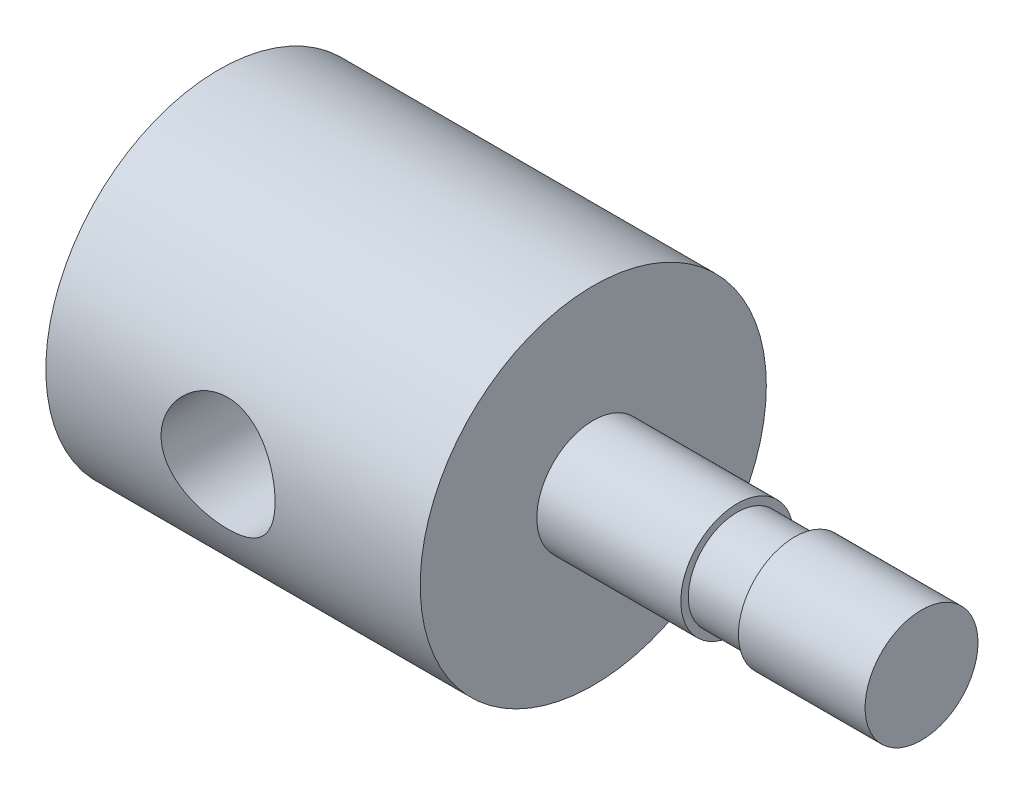
ISO-10303-21;
HEADER;
FILE_DESCRIPTION(('STEP AP214'),'2;1');
FILE_NAME('part.step','',(''),(''),'','','');
FILE_SCHEMA(('AUTOMOTIVE_DESIGN { 1 0 10303 214 1 1 1 1 }'));
ENDSEC;
DATA;
#1=APPLICATION_CONTEXT('core data for automotive mechanical design processes');
#2=APPLICATION_PROTOCOL_DEFINITION('international standard','automotive_design',2000,#1);
#3=PRODUCT_CONTEXT('',#1,'mechanical');
#4=PRODUCT('Part','Part','',(#3));
#5=PRODUCT_RELATED_PRODUCT_CATEGORY('part','',(#4));
#6=PRODUCT_DEFINITION_FORMATION('','',#4);
#7=PRODUCT_DEFINITION_CONTEXT('part definition',#1,'design');
#8=PRODUCT_DEFINITION('design','',#6,#7);
#9=PRODUCT_DEFINITION_SHAPE('','',#8);
#10=(LENGTH_UNIT() NAMED_UNIT(*) SI_UNIT(.MILLI.,.METRE.));
#11=(NAMED_UNIT(*) PLANE_ANGLE_UNIT() SI_UNIT($,.RADIAN.));
#12=(NAMED_UNIT(*) SI_UNIT($,.STERADIAN.) SOLID_ANGLE_UNIT());
#13=UNCERTAINTY_MEASURE_WITH_UNIT(LENGTH_MEASURE(1.E-05),#10,'distance_accuracy_value','');
#14=(GEOMETRIC_REPRESENTATION_CONTEXT(3) GLOBAL_UNCERTAINTY_ASSIGNED_CONTEXT((#13)) GLOBAL_UNIT_ASSIGNED_CONTEXT((#10,
#11,#12)) REPRESENTATION_CONTEXT('',''));
#15=CARTESIAN_POINT('',(0.,0.,0.));
#16=DIRECTION('',(0.,0.,1.));
#17=DIRECTION('',(1.,0.,0.));
#18=AXIS2_PLACEMENT_3D('',#15,#16,#17);
#19=CARTESIAN_POINT('',(9.,0.,0.));
#20=DIRECTION('',(1.,0.,0.));
#21=DIRECTION('',(0.,0.,-1.));
#22=AXIS2_PLACEMENT_3D('',#19,#20,#21);
#23=PLANE('',#22);
#24=CARTESIAN_POINT('',(9.,0.,0.));
#25=DIRECTION('',(1.,0.,0.));
#26=DIRECTION('',(0.,0.,-1.));
#27=AXIS2_PLACEMENT_3D('',#24,#25,#26);
#28=CIRCLE('',#27,0.98);
#29=CARTESIAN_POINT('',(9.,0.,-0.98));
#30=VERTEX_POINT('',#29);
#31=EDGE_CURVE('E86',#30,#30,#28,.T.);
#32=ORIENTED_EDGE('',*,*,#31,.T.);
#33=EDGE_LOOP('',(#32));
#34=FACE_BOUND('',#33,.T.);
#35=CARTESIAN_POINT('',(9.,0.,0.));
#36=DIRECTION('',(1.,0.,0.));
#37=DIRECTION('',(0.,0.,-1.));
#38=AXIS2_PLACEMENT_3D('',#35,#36,#37);
#39=CIRCLE('',#38,0.85);
#40=CARTESIAN_POINT('',(9.,0.,-0.85));
#41=VERTEX_POINT('',#40);
#42=EDGE_CURVE('E78',#41,#41,#39,.T.);
#43=ORIENTED_EDGE('',*,*,#42,.F.);
#44=EDGE_LOOP('',(#43));
#45=FACE_BOUND('',#44,.T.);
#46=ADVANCED_FACE('F39',(#34,#45),#23,.T.);
#47=CARTESIAN_POINT('',(6.5,0.,0.));
#48=DIRECTION('',(1.,0.,0.));
#49=DIRECTION('',(0.,0.,-1.));
#50=AXIS2_PLACEMENT_3D('',#47,#48,#49);
#51=PLANE('',#50);
#52=CARTESIAN_POINT('',(6.5,0.,0.));
#53=DIRECTION('',(1.,0.,0.));
#54=DIRECTION('',(0.,0.,-1.));
#55=AXIS2_PLACEMENT_3D('',#52,#53,#54);
#56=CIRCLE('',#55,3.005);
#57=CARTESIAN_POINT('',(6.5,0.,-3.005));
#58=VERTEX_POINT('',#57);
#59=EDGE_CURVE('E11',#58,#58,#56,.T.);
#60=ORIENTED_EDGE('',*,*,#59,.T.);
#61=EDGE_LOOP('',(#60));
#62=FACE_BOUND('',#61,.T.);
#63=CARTESIAN_POINT('',(6.5,0.,0.));
#64=DIRECTION('',(1.,0.,0.));
#65=DIRECTION('',(0.,0.,-1.));
#66=AXIS2_PLACEMENT_3D('',#63,#64,#65);
#67=CIRCLE('',#66,0.98);
#68=CARTESIAN_POINT('',(6.5,0.,-0.98));
#69=VERTEX_POINT('',#68);
#70=EDGE_CURVE('E83',#69,#69,#67,.T.);
#71=ORIENTED_EDGE('',*,*,#70,.F.);
#72=EDGE_LOOP('',(#71));
#73=FACE_BOUND('',#72,.T.);
#74=ADVANCED_FACE('F119',(#62,#73),#51,.T.);
#75=CARTESIAN_POINT('',(6.5,0.,0.));
#76=DIRECTION('',(-1.,0.,0.));
#77=DIRECTION('',(0.,0.,1.));
#78=AXIS2_PLACEMENT_3D('',#75,#76,#77);
#79=CYLINDRICAL_SURFACE('',#78,3.005);
#80=CARTESIAN_POINT('',(3.98,0.,-3.005));
#81=CARTESIAN_POINT('',(3.98000012844105,0.0540531934939104,-3.00500006318593));
#82=CARTESIAN_POINT('',(3.97555867145065,0.108105873524549,-3.00352804778147));
#83=CARTESIAN_POINT('',(3.95796306824338,0.214621275589456,-2.99780073741127));
#84=CARTESIAN_POINT('',(3.9448078169091,0.267083795070698,-2.99354508941524));
#85=CARTESIAN_POINT('',(3.91028298956671,0.36886783196554,-2.98271339950025));
#86=CARTESIAN_POINT('',(3.88892695331265,0.418194371339957,-2.97614118376814));
#87=CARTESIAN_POINT('',(3.83866729130464,0.512565724915787,-2.96134865998372));
#88=CARTESIAN_POINT('',(3.80976223137497,0.557609723292713,-2.95312803883369));
#89=CARTESIAN_POINT('',(3.74419471481002,0.643665509588741,-2.93559335674106));
#90=CARTESIAN_POINT('',(3.70732207754003,0.684511881994706,-2.92625354683561));
#91=CARTESIAN_POINT('',(3.62731307561229,0.759566925489029,-2.90767620926358));
#92=CARTESIAN_POINT('',(3.58417537738523,0.793774179755998,-2.89843870382503));
#93=CARTESIAN_POINT('',(3.4913825122129,0.855515122194297,-2.880829912973));
#94=CARTESIAN_POINT('',(3.44157879746689,0.882835386065881,-2.87249008300796));
#95=CARTESIAN_POINT('',(3.33776446996465,0.928642006077811,-2.85801161056205));
#96=CARTESIAN_POINT('',(3.28375511266641,0.947130986842649,-2.85187231422631));
#97=CARTESIAN_POINT('',(3.17494096822666,0.97413256343028,-2.84276081361563));
#98=CARTESIAN_POINT('',(3.1202213900718,0.982954533728279,-2.8396906900684));
#99=CARTESIAN_POINT('',(3.00999922953615,0.991338698449825,-2.83677530844254));
#100=CARTESIAN_POINT('',(2.95449688751931,0.990903676113885,-2.83692908105554));
#101=CARTESIAN_POINT('',(2.84690785510327,0.981026748841115,-2.84035818783209));
#102=CARTESIAN_POINT('',(2.7947790837354,0.971986553264735,-2.84349429356866));
#103=CARTESIAN_POINT('',(2.69282409484772,0.945810456450763,-2.85230719840483));
#104=CARTESIAN_POINT('',(2.64299814779474,0.928673606900077,-2.85798429511153));
#105=CARTESIAN_POINT('',(2.5461421048578,0.886523785804446,-2.87134013779324));
#106=CARTESIAN_POINT('',(2.4991687451638,0.86139044290647,-2.87904914394117));
#107=CARTESIAN_POINT('',(2.4099783376987,0.804044644630669,-2.8955872920897));
#108=CARTESIAN_POINT('',(2.36776264319459,0.771830182753345,-2.9044167512805));
#109=CARTESIAN_POINT('',(2.2870259632528,0.699299296071104,-2.92275076060677));
#110=CARTESIAN_POINT('',(2.24880258288882,0.658653839423311,-2.93226679261432));
#111=CARTESIAN_POINT('',(2.17963789160059,0.571412434733798,-2.95050780452834));
#112=CARTESIAN_POINT('',(2.14869724708179,0.52481594274499,-2.95923271199823));
#113=CARTESIAN_POINT('',(2.0947440762088,0.426375003903683,-2.97501837289779));
#114=CARTESIAN_POINT('',(2.07180961173701,0.374484931217223,-2.98206253967663));
#115=CARTESIAN_POINT('',(2.03508672962033,0.267295939287736,-2.99357276701759));
#116=CARTESIAN_POINT('',(2.02129521160714,0.211998182547729,-2.99803970145113));
#117=CARTESIAN_POINT('',(2.00377307445876,0.102084239809111,-3.00374818648543));
#118=CARTESIAN_POINT('',(1.99964017258507,0.0475387903707335,-3.00511862118835));
#119=CARTESIAN_POINT('',(2.00040888025223,-0.0614760491596006,-3.00486521850091));
#120=CARTESIAN_POINT('',(2.005309004614,-0.115945450281604,-3.00324187333751));
#121=CARTESIAN_POINT('',(2.02368542311384,-0.221663075120094,-2.99726831935216));
#122=CARTESIAN_POINT('',(2.0369162373152,-0.272958815283587,-2.9929962147207));
#123=CARTESIAN_POINT('',(2.07127295738385,-0.372583057439879,-2.98223396423136));
#124=CARTESIAN_POINT('',(2.0923998652524,-0.420911181940548,-2.97574353688095));
#125=CARTESIAN_POINT('',(2.14255815905592,-0.51462630065219,-2.96099556760361));
#126=CARTESIAN_POINT('',(2.17178051738443,-0.559904365729442,-2.95269652331595));
#127=CARTESIAN_POINT('',(2.23707494998061,-0.645045782025744,-2.93527385224311));
#128=CARTESIAN_POINT('',(2.27314907285914,-0.684907507681892,-2.92614997927084));
#129=CARTESIAN_POINT('',(2.35301518796791,-0.759922711619232,-2.90759398241181));
#130=CARTESIAN_POINT('',(2.39707840770825,-0.794789165721261,-2.89816612191201));
#131=CARTESIAN_POINT('',(2.49063326309816,-0.856666618096332,-2.880483702597));
#132=CARTESIAN_POINT('',(2.54012491554627,-0.883677592059269,-2.87222914741283));
#133=CARTESIAN_POINT('',(2.64312700768338,-0.928942756399093,-2.85791111776629));
#134=CARTESIAN_POINT('',(2.69662734260674,-0.947218161162437,-2.85184234405499));
#135=CARTESIAN_POINT('',(2.80619129090307,-0.974421229095633,-2.84266396222798));
#136=CARTESIAN_POINT('',(2.86225377351606,-0.983352975134272,-2.83955306167405));
#137=CARTESIAN_POINT('',(2.972322621993,-0.991301406586046,-2.8367873283564));
#138=CARTESIAN_POINT('',(3.02629089029454,-0.99079340783196,-2.83696680985602));
#139=CARTESIAN_POINT('',(3.13333069906645,-0.981042306595476,-2.84035332691357));
#140=CARTESIAN_POINT('',(3.18640229040604,-0.971799701339716,-2.84356019013463));
#141=CARTESIAN_POINT('',(3.28918772785753,-0.945174845990295,-2.85251817754307));
#142=CARTESIAN_POINT('',(3.33894498591742,-0.927943090407343,-2.85822215637925));
#143=CARTESIAN_POINT('',(3.43490058196984,-0.885950295376745,-2.87151525346518));
#144=CARTESIAN_POINT('',(3.48109813899936,-0.861187609579405,-2.87910478385213));
#145=CARTESIAN_POINT('',(3.57076532149106,-0.803598774391038,-2.89571881975262));
#146=CARTESIAN_POINT('',(3.61403359831274,-0.770472899713704,-2.90479083547508));
#147=CARTESIAN_POINT('',(3.69455084150154,-0.697608633093183,-2.9231450437137));
#148=CARTESIAN_POINT('',(3.73179811826523,-0.657868391364729,-2.93242729439541));
#149=CARTESIAN_POINT('',(3.80063089568753,-0.571102020081651,-2.95057654498027));
#150=CARTESIAN_POINT('',(3.8319497127272,-0.523857545400133,-2.95941465825304));
#151=CARTESIAN_POINT('',(3.88616539235549,-0.424486212277914,-2.97529208437051));
#152=CARTESIAN_POINT('',(3.90906463495212,-0.37236073881174,-2.98233190537649));
#153=CARTESIAN_POINT('',(3.94469311857279,-0.267514810856308,-2.99350839905318));
#154=CARTESIAN_POINT('',(3.95789164983739,-0.214968079562847,-2.99777766024758));
#155=CARTESIAN_POINT('',(3.9755438855018,-0.108280447376143,-3.00352306472874));
#156=CARTESIAN_POINT('',(3.97999987135276,-0.0541399661315012,-3.00499993671263));
#157=CARTESIAN_POINT('',(3.98,0.,-3.005));
#158=B_SPLINE_CURVE_WITH_KNOTS('',3,(#80,#81,#82,#83,#84,#85,#86,#87,#88,#89,#90,#91,#92,#93,
#94,#95,#96,#97,#98,#99,#100,#101,#102,#103,#104,#105,#106,#107,#108,#109,#110,#111,#112,#113,
#114,#115,#116,#117,#118,#119,#120,#121,#122,#123,#124,#125,#126,#127,#128,#129,#130,#131,#132,
#133,#134,#135,#136,#137,#138,#139,#140,#141,#142,#143,#144,#145,#146,#147,#148,#149,#150,#151,
#152,#153,#154,#155,#156,#157),.UNSPECIFIED.,.T.,.F.,(4,2,2,2,2,2,2,2,2,2,2,2,2,2,2,2,2,2,2,2,2,
2,2,2,2,2,2,2,2,2,2,2,2,2,2,2,2,2,4),(0.,0.161960392905863,0.323941330194462,0.485655973781984,
0.647401362556034,0.814092644936941,0.980819461060832,1.15220969624744,1.32354896315181,
1.4892283929574,1.65485800969713,1.81311634619356,1.97139322314771,2.13217533485536,
2.29300306450274,2.46202037705776,2.63105314950435,2.80169078780196,2.9722705333286,
3.13560821058024,3.29891903480842,3.45762937935902,3.61635987083242,3.77921123955733,
3.94211137612186,4.1122323489642,4.28235384826894,4.452060080558,4.62169212584068,
4.78280698441909,4.94391267191761,5.10209970454019,5.26032134359228,5.42531407881503,
5.59035303396031,5.76161971410099,5.93283794404668,6.09510068476053,6.2573210758195),.UNSPECIFIED.);
#159=CARTESIAN_POINT('',(3.98,0.,-3.005));
#160=VERTEX_POINT('',#159);
#161=EDGE_CURVE('E73',#160,#160,#158,.T.);
#162=ORIENTED_EDGE('',*,*,#161,.T.);
#163=EDGE_LOOP('',(#162));
#164=FACE_BOUND('',#163,.T.);
#165=CARTESIAN_POINT('',(3.98,0.,3.005));
#166=CARTESIAN_POINT('',(3.98000012844105,-0.0540531934939104,3.00500006318593));
#167=CARTESIAN_POINT('',(3.97555867145065,-0.108105873524549,3.00352804778147));
#168=CARTESIAN_POINT('',(3.95796306824338,-0.214621275589456,2.99780073741127));
#169=CARTESIAN_POINT('',(3.9448078169091,-0.267083795070698,2.99354508941524));
#170=CARTESIAN_POINT('',(3.91028298956671,-0.36886783196554,2.98271339950025));
#171=CARTESIAN_POINT('',(3.88892695331265,-0.418194371339957,2.97614118376814));
#172=CARTESIAN_POINT('',(3.83866729130464,-0.512565724915787,2.96134865998372));
#173=CARTESIAN_POINT('',(3.80976223137497,-0.557609723292713,2.95312803883369));
#174=CARTESIAN_POINT('',(3.74419471481002,-0.643665509588741,2.93559335674106));
#175=CARTESIAN_POINT('',(3.70732207754003,-0.684511881994706,2.92625354683561));
#176=CARTESIAN_POINT('',(3.62731307561229,-0.759566925489029,2.90767620926358));
#177=CARTESIAN_POINT('',(3.58417537738523,-0.793774179755998,2.89843870382503));
#178=CARTESIAN_POINT('',(3.4913825122129,-0.855515122194296,2.880829912973));
#179=CARTESIAN_POINT('',(3.44157879746689,-0.88283538606588,2.87249008300796));
#180=CARTESIAN_POINT('',(3.33776446996465,-0.928642006077811,2.85801161056205));
#181=CARTESIAN_POINT('',(3.28375511266641,-0.947130986842649,2.85187231422631));
#182=CARTESIAN_POINT('',(3.17494096822666,-0.97413256343028,2.84276081361563));
#183=CARTESIAN_POINT('',(3.1202213900718,-0.982954533728279,2.8396906900684));
#184=CARTESIAN_POINT('',(3.00999922953615,-0.991338698449825,2.83677530844254));
#185=CARTESIAN_POINT('',(2.95449688751932,-0.990903676113885,2.83692908105554));
#186=CARTESIAN_POINT('',(2.84690785510327,-0.981026748841115,2.84035818783209));
#187=CARTESIAN_POINT('',(2.7947790837354,-0.971986553264735,2.84349429356866));
#188=CARTESIAN_POINT('',(2.69282409484772,-0.945810456450763,2.85230719840483));
#189=CARTESIAN_POINT('',(2.64299814779474,-0.928673606900077,2.85798429511153));
#190=CARTESIAN_POINT('',(2.5461421048578,-0.886523785804446,2.87134013779324));
#191=CARTESIAN_POINT('',(2.4991687451638,-0.86139044290647,2.87904914394117));
#192=CARTESIAN_POINT('',(2.4099783376987,-0.804044644630669,2.8955872920897));
#193=CARTESIAN_POINT('',(2.36776264319459,-0.771830182753346,2.9044167512805));
#194=CARTESIAN_POINT('',(2.2870259632528,-0.699299296071104,2.92275076060677));
#195=CARTESIAN_POINT('',(2.24880258288882,-0.658653839423312,2.93226679261432));
#196=CARTESIAN_POINT('',(2.17963789160059,-0.571412434733799,2.95050780452834));
#197=CARTESIAN_POINT('',(2.14869724708179,-0.524815942744991,2.95923271199823));
#198=CARTESIAN_POINT('',(2.0947440762088,-0.426375003903684,2.97501837289779));
#199=CARTESIAN_POINT('',(2.07180961173701,-0.374484931217224,2.98206253967662));
#200=CARTESIAN_POINT('',(2.03508672962034,-0.267295939287737,2.99357276701759));
#201=CARTESIAN_POINT('',(2.02129521160714,-0.21199818254773,2.99803970145113));
#202=CARTESIAN_POINT('',(2.00377307445877,-0.102084239809112,3.00374818648543));
#203=CARTESIAN_POINT('',(1.99964017258507,-0.0475387903707343,3.00511862118835));
#204=CARTESIAN_POINT('',(2.00040888025223,0.0614760491595999,3.00486521850091));
#205=CARTESIAN_POINT('',(2.005309004614,0.115945450281603,3.00324187333751));
#206=CARTESIAN_POINT('',(2.02368542311384,0.221663075120093,2.99726831935216));
#207=CARTESIAN_POINT('',(2.0369162373152,0.272958815283586,2.9929962147207));
#208=CARTESIAN_POINT('',(2.07127295738385,0.372583057439879,2.98223396423136));
#209=CARTESIAN_POINT('',(2.0923998652524,0.420911181940548,2.97574353688095));
#210=CARTESIAN_POINT('',(2.14255815905592,0.51462630065219,2.96099556760361));
#211=CARTESIAN_POINT('',(2.17178051738443,0.559904365729441,2.95269652331595));
#212=CARTESIAN_POINT('',(2.23707494998061,0.645045782025744,2.93527385224311));
#213=CARTESIAN_POINT('',(2.27314907285914,0.684907507681891,2.92614997927084));
#214=CARTESIAN_POINT('',(2.35301518796791,0.759922711619232,2.90759398241181));
#215=CARTESIAN_POINT('',(2.39707840770825,0.79478916572126,2.89816612191201));
#216=CARTESIAN_POINT('',(2.49063326309816,0.856666618096332,2.880483702597));
#217=CARTESIAN_POINT('',(2.54012491554627,0.883677592059268,2.87222914741283));
#218=CARTESIAN_POINT('',(2.64312700768338,0.928942756399092,2.85791111776629));
#219=CARTESIAN_POINT('',(2.69662734260674,0.947218161162437,2.85184234405499));
#220=CARTESIAN_POINT('',(2.80619129090306,0.974421229095633,2.84266396222798));
#221=CARTESIAN_POINT('',(2.86225377351606,0.983352975134272,2.83955306167405));
#222=CARTESIAN_POINT('',(2.972322621993,0.991301406586046,2.8367873283564));
#223=CARTESIAN_POINT('',(3.02629089029454,0.99079340783196,2.83696680985602));
#224=CARTESIAN_POINT('',(3.13333069906644,0.981042306595476,2.84035332691357));
#225=CARTESIAN_POINT('',(3.18640229040604,0.971799701339716,2.84356019013463));
#226=CARTESIAN_POINT('',(3.28918772785753,0.945174845990295,2.85251817754307));
#227=CARTESIAN_POINT('',(3.33894498591742,0.927943090407343,2.85822215637925));
#228=CARTESIAN_POINT('',(3.43490058196984,0.885950295376745,2.87151525346518));
#229=CARTESIAN_POINT('',(3.48109813899936,0.861187609579405,2.87910478385213));
#230=CARTESIAN_POINT('',(3.57076532149106,0.803598774391038,2.89571881975262));
#231=CARTESIAN_POINT('',(3.61403359831274,0.770472899713704,2.90479083547508));
#232=CARTESIAN_POINT('',(3.69455084150154,0.697608633093184,2.9231450437137));
#233=CARTESIAN_POINT('',(3.73179811826523,0.65786839136473,2.93242729439541));
#234=CARTESIAN_POINT('',(3.80063089568753,0.571102020081652,2.95057654498027));
#235=CARTESIAN_POINT('',(3.8319497127272,0.523857545400133,2.95941465825304));
#236=CARTESIAN_POINT('',(3.88616539235549,0.424486212277915,2.97529208437051));
#237=CARTESIAN_POINT('',(3.90906463495212,0.37236073881174,2.98233190537649));
#238=CARTESIAN_POINT('',(3.94469311857279,0.267514810856308,2.99350839905318));
#239=CARTESIAN_POINT('',(3.95789164983739,0.214968079562848,2.99777766024758));
#240=CARTESIAN_POINT('',(3.9755438855018,0.108280447376143,3.00352306472874));
#241=CARTESIAN_POINT('',(3.97999987135276,0.0541399661315012,3.00499993671263));
#242=CARTESIAN_POINT('',(3.98,0.,3.005));
#243=B_SPLINE_CURVE_WITH_KNOTS('',3,(#165,#166,#167,#168,#169,#170,#171,#172,#173,#174,#175,
#176,#177,#178,#179,#180,#181,#182,#183,#184,#185,#186,#187,#188,#189,#190,#191,#192,#193,#194,
#195,#196,#197,#198,#199,#200,#201,#202,#203,#204,#205,#206,#207,#208,#209,#210,#211,#212,#213,
#214,#215,#216,#217,#218,#219,#220,#221,#222,#223,#224,#225,#226,#227,#228,#229,#230,#231,#232,
#233,#234,#235,#236,#237,#238,#239,#240,#241,#242),.UNSPECIFIED.,.T.,.F.,(4,2,2,2,2,2,2,2,2,2,2,
2,2,2,2,2,2,2,2,2,2,2,2,2,2,2,2,2,2,2,2,2,2,2,2,2,2,2,4),(0.,0.161960392905863,
0.323941330194462,0.485655973781984,0.647401362556034,0.81409264493694,0.980819461060831,
1.15220969624744,1.32354896315181,1.4892283929574,1.65485800969713,1.81311634619355,
1.97139322314771,2.13217533485536,2.29300306450273,2.46202037705776,2.63105314950435,
2.80169078780196,2.9722705333286,3.13560821058024,3.29891903480841,3.45762937935902,
3.61635987083242,3.77921123955733,3.94211137612186,4.1122323489642,4.28235384826894,
4.45206008055799,4.62169212584068,4.78280698441909,4.94391267191761,5.10209970454019,
5.26032134359228,5.42531407881503,5.59035303396031,5.76161971410099,5.93283794404668,
6.09510068476053,6.2573210758195),.UNSPECIFIED.);
#244=CARTESIAN_POINT('',(3.98,0.,3.005));
#245=VERTEX_POINT('',#244);
#246=EDGE_CURVE('E106',#245,#245,#243,.T.);
#247=ORIENTED_EDGE('',*,*,#246,.T.);
#248=EDGE_LOOP('',(#247));
#249=FACE_BOUND('',#248,.T.);
#250=ORIENTED_EDGE('',*,*,#59,.F.);
#251=EDGE_LOOP('',(#250));
#252=FACE_BOUND('',#251,.T.);
#253=CARTESIAN_POINT('',(0.,0.,0.));
#254=DIRECTION('',(1.,0.,0.));
#255=DIRECTION('',(0.,0.,-1.));
#256=AXIS2_PLACEMENT_3D('',#253,#254,#255);
#257=CIRCLE('',#256,3.005);
#258=CARTESIAN_POINT('',(0.,0.,-3.005));
#259=VERTEX_POINT('',#258);
#260=EDGE_CURVE('E52',#259,#259,#257,.T.);
#261=ORIENTED_EDGE('',*,*,#260,.T.);
#262=EDGE_LOOP('',(#261));
#263=FACE_BOUND('',#262,.T.);
#264=ADVANCED_FACE('F41',(#164,#249,#252,#263),#79,.T.);
#265=CARTESIAN_POINT('',(0.,0.,0.));
#266=DIRECTION('',(1.,0.,0.));
#267=DIRECTION('',(0.,0.,-1.));
#268=AXIS2_PLACEMENT_3D('',#265,#266,#267);
#269=PLANE('',#268);
#270=CARTESIAN_POINT('',(0.,0.,0.));
#271=DIRECTION('',(-1.,0.,0.));
#272=DIRECTION('',(0.,0.,1.));
#273=AXIS2_PLACEMENT_3D('',#270,#271,#272);
#274=CIRCLE('',#273,1.24999999999999);
#275=CARTESIAN_POINT('',(0.,0.,1.24999999999999));
#276=VERTEX_POINT('',#275);
#277=EDGE_CURVE('E67',#276,#276,#274,.T.);
#278=ORIENTED_EDGE('',*,*,#277,.F.);
#279=EDGE_LOOP('',(#278));
#280=FACE_BOUND('',#279,.T.);
#281=ORIENTED_EDGE('',*,*,#260,.F.);
#282=EDGE_LOOP('',(#281));
#283=FACE_BOUND('',#282,.T.);
#284=ADVANCED_FACE('F118',(#280,#283),#269,.F.);
#285=CARTESIAN_POINT('',(9.,0.,0.));
#286=DIRECTION('',(-1.,0.,0.));
#287=DIRECTION('',(0.,0.,1.));
#288=AXIS2_PLACEMENT_3D('',#285,#286,#287);
#289=CYLINDRICAL_SURFACE('',#288,0.98);
#290=ORIENTED_EDGE('',*,*,#31,.F.);
#291=EDGE_LOOP('',(#290));
#292=FACE_BOUND('',#291,.T.);
#293=ORIENTED_EDGE('',*,*,#70,.T.);
#294=EDGE_LOOP('',(#293));
#295=FACE_BOUND('',#294,.T.);
#296=ADVANCED_FACE('F127',(#292,#295),#289,.T.);
#297=CARTESIAN_POINT('',(10.,0.,0.));
#298=DIRECTION('',(-1.,0.,0.));
#299=DIRECTION('',(0.,0.,1.));
#300=AXIS2_PLACEMENT_3D('',#297,#298,#299);
#301=CYLINDRICAL_SURFACE('',#300,0.85);
#302=CARTESIAN_POINT('',(10.,0.,0.));
#303=DIRECTION('',(1.,0.,0.));
#304=DIRECTION('',(0.,0.,-1.));
#305=AXIS2_PLACEMENT_3D('',#302,#303,#304);
#306=CIRCLE('',#305,0.85);
#307=CARTESIAN_POINT('',(10.,0.,-0.85));
#308=VERTEX_POINT('',#307);
#309=EDGE_CURVE('E80',#308,#308,#306,.T.);
#310=ORIENTED_EDGE('',*,*,#309,.F.);
#311=EDGE_LOOP('',(#310));
#312=FACE_BOUND('',#311,.T.);
#313=ORIENTED_EDGE('',*,*,#42,.T.);
#314=EDGE_LOOP('',(#313));
#315=FACE_BOUND('',#314,.T.);
#316=ADVANCED_FACE('F134',(#312,#315),#301,.T.);
#317=CARTESIAN_POINT('',(10.,0.,0.));
#318=DIRECTION('',(1.,0.,0.));
#319=DIRECTION('',(0.,0.,-1.));
#320=AXIS2_PLACEMENT_3D('',#317,#318,#319);
#321=PLANE('',#320);
#322=CARTESIAN_POINT('',(10.,0.,0.));
#323=DIRECTION('',(1.,0.,0.));
#324=DIRECTION('',(0.,0.,-1.));
#325=AXIS2_PLACEMENT_3D('',#322,#323,#324);
#326=CIRCLE('',#325,0.98);
#327=CARTESIAN_POINT('',(10.,0.,-0.98));
#328=VERTEX_POINT('',#327);
#329=EDGE_CURVE('E66',#328,#328,#326,.T.);
#330=ORIENTED_EDGE('',*,*,#329,.F.);
#331=EDGE_LOOP('',(#330));
#332=FACE_BOUND('',#331,.T.);
#333=ORIENTED_EDGE('',*,*,#309,.T.);
#334=EDGE_LOOP('',(#333));
#335=FACE_BOUND('',#334,.T.);
#336=ADVANCED_FACE('F150',(#332,#335),#321,.F.);
#337=CARTESIAN_POINT('',(12.2,0.,0.));
#338=DIRECTION('',(-1.,0.,0.));
#339=DIRECTION('',(0.,0.,1.));
#340=AXIS2_PLACEMENT_3D('',#337,#338,#339);
#341=CYLINDRICAL_SURFACE('',#340,0.98);
#342=CARTESIAN_POINT('',(12.2,0.,0.));
#343=DIRECTION('',(1.,0.,0.));
#344=DIRECTION('',(0.,0.,-1.));
#345=AXIS2_PLACEMENT_3D('',#342,#343,#344);
#346=CIRCLE('',#345,0.98);
#347=CARTESIAN_POINT('',(12.2,0.,-0.98));
#348=VERTEX_POINT('',#347);
#349=EDGE_CURVE('E70',#348,#348,#346,.T.);
#350=ORIENTED_EDGE('',*,*,#349,.F.);
#351=EDGE_LOOP('',(#350));
#352=FACE_BOUND('',#351,.T.);
#353=ORIENTED_EDGE('',*,*,#329,.T.);
#354=EDGE_LOOP('',(#353));
#355=FACE_BOUND('',#354,.T.);
#356=ADVANCED_FACE('F152',(#352,#355),#341,.T.);
#357=CARTESIAN_POINT('',(12.2,0.,0.));
#358=DIRECTION('',(1.,0.,0.));
#359=DIRECTION('',(0.,0.,-1.));
#360=AXIS2_PLACEMENT_3D('',#357,#358,#359);
#361=PLANE('',#360);
#362=ORIENTED_EDGE('',*,*,#349,.T.);
#363=EDGE_LOOP('',(#362));
#364=FACE_BOUND('',#363,.T.);
#365=ADVANCED_FACE('F60',(#364),#361,.T.);
#366=CARTESIAN_POINT('',(5.,0.,0.));
#367=DIRECTION('',(-1.,0.,0.));
#368=DIRECTION('',(0.,0.,1.));
#369=AXIS2_PLACEMENT_3D('',#366,#367,#368);
#370=CONICAL_SURFACE('',#369,1.25,1.02974425867665);
#371=CARTESIAN_POINT('',(5.75107577378445,0.,0.));
#372=VERTEX_POINT('',#371);
#373=VERTEX_LOOP('',#372);
#374=FACE_BOUND('',#373,.T.);
#375=CARTESIAN_POINT('',(5.,0.,0.));
#376=DIRECTION('',(-1.,0.,0.));
#377=DIRECTION('',(0.,0.,1.));
#378=AXIS2_PLACEMENT_3D('',#375,#376,#377);
#379=CIRCLE('',#378,1.25);
#380=CARTESIAN_POINT('',(5.,0.,1.25));
#381=VERTEX_POINT('',#380);
#382=EDGE_CURVE('E64',#381,#381,#379,.T.);
#383=ORIENTED_EDGE('',*,*,#382,.T.);
#384=EDGE_LOOP('',(#383));
#385=FACE_BOUND('',#384,.T.);
#386=ADVANCED_FACE('F56',(#374,#385),#370,.F.);
#387=CARTESIAN_POINT('',(0.,0.,0.));
#388=DIRECTION('',(-1.,0.,0.));
#389=DIRECTION('',(0.,0.,1.));
#390=AXIS2_PLACEMENT_3D('',#387,#388,#389);
#391=CYLINDRICAL_SURFACE('',#390,1.24999999999999);
#392=CARTESIAN_POINT('',(3.98,0.,1.24999999999999));
#393=CARTESIAN_POINT('',(3.97999600838298,0.0476665656031358,1.24999612937022));
#394=CARTESIAN_POINT('',(3.97652974616273,0.0953900929189056,1.24724601441156));
#395=CARTESIAN_POINT('',(3.9628969947582,0.189297245323469,1.23649172469009));
#396=CARTESIAN_POINT('',(3.95271809554527,0.235477851463933,1.22847781857103));
#397=CARTESIAN_POINT('',(3.92638791913205,0.3246974941919,1.20795474834515));
#398=CARTESIAN_POINT('',(3.91027363482207,0.367754053159227,1.19547344109795));
#399=CARTESIAN_POINT('',(3.8728653016153,0.450225149870585,1.16692153527007));
#400=CARTESIAN_POINT('',(3.85157076802473,0.48963934633787,1.15085060083484));
#401=CARTESIAN_POINT('',(3.79646065128664,0.577272902714976,1.11009981953722));
#402=CARTESIAN_POINT('',(3.76085585396325,0.623873426793653,1.08435810569793));
#403=CARTESIAN_POINT('',(3.68288014323819,0.709497112795769,1.03038136883836));
#404=CARTESIAN_POINT('',(3.64048995001097,0.748497959269834,1.0021393468877));
#405=CARTESIAN_POINT('',(3.54896352060395,0.819182896775925,0.945263290925217));
#406=CARTESIAN_POINT('',(3.49973529548759,0.850747939862248,0.916629759256312));
#407=CARTESIAN_POINT('',(3.39504868732976,0.905261842842628,0.862816708335512));
#408=CARTESIAN_POINT('',(3.33961241836752,0.928240096448298,0.837625596652876));
#409=CARTESIAN_POINT('',(3.24700457742267,0.956720802365265,0.804642519052354));
#410=CARTESIAN_POINT('',(3.21188375942682,0.965513327322309,0.793979117362296));
#411=CARTESIAN_POINT('',(3.13991988683727,0.979264827599571,0.776956248294609));
#412=CARTESIAN_POINT('',(3.1030812267513,0.984233070707579,0.770586380632976));
#413=CARTESIAN_POINT('',(3.02821270244589,0.989978208921299,0.763196486282922));
#414=CARTESIAN_POINT('',(2.99017565745024,0.990721192641607,0.762219745946367));
#415=CARTESIAN_POINT('',(2.91453395168889,0.987846815626805,0.765938829924526));
#416=CARTESIAN_POINT('',(2.87692974070901,0.984225271365874,0.770640096782072));
#417=CARTESIAN_POINT('',(2.79704828822964,0.971993407697793,0.786026104595987));
#418=CARTESIAN_POINT('',(2.75506250077656,0.962640072764918,0.797591686825782));
#419=CARTESIAN_POINT('',(2.67394638272981,0.939150883271654,0.825119362869238));
#420=CARTESIAN_POINT('',(2.63482469606003,0.925001222811395,0.841094123267664));
#421=CARTESIAN_POINT('',(2.54200439440216,0.884884399914884,0.883559715583098));
#422=CARTESIAN_POINT('',(2.49001939375747,0.856483653874589,0.911479831176683));
#423=CARTESIAN_POINT('',(2.39228668543396,0.791384076468414,0.968555269242376));
#424=CARTESIAN_POINT('',(2.34654768511075,0.754673846683268,0.997712243290644));
#425=CARTESIAN_POINT('',(2.26075388646569,0.672246136768654,1.05506654071879));
#426=CARTESIAN_POINT('',(2.2208490466976,0.626345616441616,1.08322783114334));
#427=CARTESIAN_POINT('',(2.14930994438369,0.526395480325532,1.13514726138958));
#428=CARTESIAN_POINT('',(2.11765297665221,0.472368896086258,1.15891743560928));
#429=CARTESIAN_POINT('',(2.07224301608218,0.373957323202099,1.19353765591997));
#430=CARTESIAN_POINT('',(2.05596092688997,0.331350522410494,1.2061342018464));
#431=CARTESIAN_POINT('',(2.02926448640936,0.243305264666182,1.22692369630464));
#432=CARTESIAN_POINT('',(2.01884567097036,0.197868991358906,1.23511999485577));
#433=CARTESIAN_POINT('',(2.00447504743825,0.105126430330321,1.24645084022689));
#434=CARTESIAN_POINT('',(2.00055392836105,0.0578123431819079,1.24956136571564));
#435=CARTESIAN_POINT('',(1.999556148868,-0.0369342697515305,1.25035145402942));
#436=CARTESIAN_POINT('',(2.00247881674689,-0.084366783456764,1.24803154984126));
#437=CARTESIAN_POINT('',(2.01449274203587,-0.174342890532989,1.23854852778678));
#438=CARTESIAN_POINT('',(2.02311667076913,-0.216990158317898,1.23175246399474));
#439=CARTESIAN_POINT('',(2.04557568828139,-0.300023480156971,1.21420274786431));
#440=CARTESIAN_POINT('',(2.05941202638496,-0.340408989438937,1.20344814674704));
#441=CARTESIAN_POINT('',(2.09281806569393,-0.420949102674092,1.17779989965729));
#442=CARTESIAN_POINT('',(2.11272293708625,-0.460887111623363,1.16266808564593));
#443=CARTESIAN_POINT('',(2.15705313759621,-0.53687745349487,1.12959408846139));
#444=CARTESIAN_POINT('',(2.18148027430558,-0.572928223501085,1.11165078195057));
#445=CARTESIAN_POINT('',(2.23933360737441,-0.647484808043862,1.07024006597438));
#446=CARTESIAN_POINT('',(2.27358689053542,-0.685125799213727,1.04637436189015));
#447=CARTESIAN_POINT('',(2.34702961660448,-0.754484054755394,0.997524724335878));
#448=CARTESIAN_POINT('',(2.38622643013978,-0.786192294562231,0.972539157810565));
#449=CARTESIAN_POINT('',(2.46969747169071,-0.843793374837143,0.923020603079291));
#450=CARTESIAN_POINT('',(2.5140200918581,-0.869622568911627,0.898494984619545));
#451=CARTESIAN_POINT('',(2.60749006522312,-0.914584600293128,0.852677422578565));
#452=CARTESIAN_POINT('',(2.65662716840183,-0.933731284285928,0.831378844797454));
#453=CARTESIAN_POINT('',(2.74232480230929,-0.959179860870177,0.801699513858711));
#454=CARTESIAN_POINT('',(2.77756025815795,-0.96763601515774,0.791383129762132));
#455=CARTESIAN_POINT('',(2.84969260546349,-0.980688773504756,0.775151424287282));
#456=CARTESIAN_POINT('',(2.8865853741236,-0.985294450626701,0.769225760616934));
#457=CARTESIAN_POINT('',(2.96142969545772,-0.990301663062267,0.762772947805216));
#458=CARTESIAN_POINT('',(2.99938704670443,-0.990671970027013,0.762285899435171));
#459=CARTESIAN_POINT('',(3.07476416495421,-0.987088267635316,0.766917957980397));
#460=CARTESIAN_POINT('',(3.11218329427629,-0.9831294982283,0.77204323595653));
#461=CARTESIAN_POINT('',(3.19236321652768,-0.970103856485983,0.788367426916483));
#462=CARTESIAN_POINT('',(3.23478242616675,-0.960207062743388,0.800537933566537));
#463=CARTESIAN_POINT('',(3.31664976609974,-0.935542209131718,0.829227292137535));
#464=CARTESIAN_POINT('',(3.35608888346792,-0.920760045906039,0.845758705149357));
#465=CARTESIAN_POINT('',(3.44928017553748,-0.879109871592913,0.889346375884777));
#466=CARTESIAN_POINT('',(3.50130640515702,-0.849807871055893,0.917753533759932));
#467=CARTESIAN_POINT('',(3.59899550123362,-0.78277402174683,0.975570631856166));
#468=CARTESIAN_POINT('',(3.64465017405319,-0.745031477987404,1.00498180384015));
#469=CARTESIAN_POINT('',(3.72992513038734,-0.660514999595179,1.06249011832385));
#470=CARTESIAN_POINT('',(3.76941533438392,-0.613584126958465,1.09055200681621));
#471=CARTESIAN_POINT('',(3.83987407549469,-0.511500819523926,1.14197659562819));
#472=CARTESIAN_POINT('',(3.87086483640924,-0.456370418604735,1.16535150722667));
#473=CARTESIAN_POINT('',(3.91458384163479,-0.356724675829544,1.19880109628662));
#474=CARTESIAN_POINT('',(3.93000122988421,-0.314013565614836,1.2107611993878));
#475=CARTESIAN_POINT('',(3.95494209275131,-0.225978094978212,1.23022406681042));
#476=CARTESIAN_POINT('',(3.96447973896099,-0.180660308082251,1.23773754679877));
#477=CARTESIAN_POINT('',(3.97385059400427,-0.112446326624201,1.24513420684542));
#478=CARTESIAN_POINT('',(3.97615172965508,-0.090064714719856,1.24695401722612));
#479=CARTESIAN_POINT('',(3.97922756940847,-0.0451263536989861,1.24938798161743));
#480=CARTESIAN_POINT('',(3.98000188998403,-0.0225695620065049,1.25000183269798));
#481=CARTESIAN_POINT('',(3.98,0.,1.24999999999999));
#482=B_SPLINE_CURVE_WITH_KNOTS('',3,(#392,#393,#394,#395,#396,#397,#398,#399,#400,#401,#402,
#403,#404,#405,#406,#407,#408,#409,#410,#411,#412,#413,#414,#415,#416,#417,#418,#419,#420,#421,
#422,#423,#424,#425,#426,#427,#428,#429,#430,#431,#432,#433,#434,#435,#436,#437,#438,#439,#440,
#441,#442,#443,#444,#445,#446,#447,#448,#449,#450,#451,#452,#453,#454,#455,#456,#457,#458,#459,
#460,#461,#462,#463,#464,#465,#466,#467,#468,#469,#470,#471,#472,#473,#474,#475,#476,#477,#478,
#479,#480,#481),.UNSPECIFIED.,.T.,.F.,(4,2,2,2,2,2,2,2,2,2,2,2,2,2,2,2,2,2,2,2,2,2,2,2,2,2,2,2,
2,2,2,2,2,2,2,2,2,2,2,2,2,2,2,2,4),(0.,0.142902280342446,0.286069495582771,0.428359102326461,
0.570662027624558,0.761790197483474,0.953471401486535,1.14803959702477,1.34193552257772,
1.45478743518257,1.56736499316732,1.68084482258931,1.79443351226592,1.92731977667446,
2.06059183997446,2.25603533251811,2.45174856437554,2.65183773362057,2.85137012342743,
2.99275751806276,3.13403711770816,3.27598210723829,3.41791316570954,3.54945212596029,
3.68102263390928,3.82185975655548,3.96275329513564,4.13078749243158,4.29907525192961,
4.46910635882933,4.63878302655576,4.75141995332429,4.86379071424246,4.97698948084005,
5.09031284079108,5.22523980819589,5.36055974324859,5.55790839598072,5.75550853986912,
5.95683622714221,6.15763236498464,6.29794890097417,6.43792590442867,6.50557147488069,
6.57323403534105),.UNSPECIFIED.);
#483=CARTESIAN_POINT('',(3.98,0.,1.24999999999999));
#484=VERTEX_POINT('',#483);
#485=EDGE_CURVE('E44',#484,#484,#482,.T.);
#486=ORIENTED_EDGE('',*,*,#485,.T.);
#487=EDGE_LOOP('',(#486));
#488=FACE_BOUND('',#487,.T.);
#489=CARTESIAN_POINT('',(3.98,0.,-1.24999999999999));
#490=CARTESIAN_POINT('',(3.97999600838298,-0.0476665656031358,-1.24999612937022));
#491=CARTESIAN_POINT('',(3.97652974616273,-0.0953900929189056,-1.24724601441156));
#492=CARTESIAN_POINT('',(3.9628969947582,-0.189297245323469,-1.23649172469009));
#493=CARTESIAN_POINT('',(3.95271809554527,-0.235477851463933,-1.22847781857103));
#494=CARTESIAN_POINT('',(3.92638791913205,-0.3246974941919,-1.20795474834515));
#495=CARTESIAN_POINT('',(3.91027363482207,-0.367754053159227,-1.19547344109795));
#496=CARTESIAN_POINT('',(3.8728653016153,-0.450225149870585,-1.16692153527007));
#497=CARTESIAN_POINT('',(3.85157076802473,-0.48963934633787,-1.15085060083484));
#498=CARTESIAN_POINT('',(3.79646065128664,-0.577272902714976,-1.11009981953722));
#499=CARTESIAN_POINT('',(3.76085585396325,-0.623873426793653,-1.08435810569793));
#500=CARTESIAN_POINT('',(3.68288014323819,-0.709497112795769,-1.03038136883836));
#501=CARTESIAN_POINT('',(3.64048995001097,-0.748497959269834,-1.0021393468877));
#502=CARTESIAN_POINT('',(3.54896352060395,-0.819182896775925,-0.945263290925217));
#503=CARTESIAN_POINT('',(3.49973529548759,-0.850747939862248,-0.916629759256312));
#504=CARTESIAN_POINT('',(3.39504868732976,-0.905261842842628,-0.862816708335512));
#505=CARTESIAN_POINT('',(3.33961241836752,-0.928240096448298,-0.837625596652876));
#506=CARTESIAN_POINT('',(3.24700457742267,-0.956720802365265,-0.804642519052354));
#507=CARTESIAN_POINT('',(3.21188375942682,-0.965513327322309,-0.793979117362296));
#508=CARTESIAN_POINT('',(3.13991988683727,-0.979264827599571,-0.776956248294609));
#509=CARTESIAN_POINT('',(3.1030812267513,-0.984233070707579,-0.770586380632976));
#510=CARTESIAN_POINT('',(3.02821270244589,-0.989978208921299,-0.763196486282922));
#511=CARTESIAN_POINT('',(2.99017565745024,-0.990721192641607,-0.762219745946367));
#512=CARTESIAN_POINT('',(2.91453395168889,-0.987846815626805,-0.765938829924526));
#513=CARTESIAN_POINT('',(2.87692974070901,-0.984225271365874,-0.770640096782072));
#514=CARTESIAN_POINT('',(2.79704828822964,-0.971993407697793,-0.786026104595987));
#515=CARTESIAN_POINT('',(2.75506250077656,-0.962640072764918,-0.797591686825782));
#516=CARTESIAN_POINT('',(2.67394638272981,-0.939150883271654,-0.825119362869238));
#517=CARTESIAN_POINT('',(2.63482469606003,-0.925001222811395,-0.841094123267664));
#518=CARTESIAN_POINT('',(2.54200439440216,-0.884884399914884,-0.883559715583098));
#519=CARTESIAN_POINT('',(2.49001939375747,-0.856483653874589,-0.911479831176683));
#520=CARTESIAN_POINT('',(2.39228668543396,-0.791384076468414,-0.968555269242376));
#521=CARTESIAN_POINT('',(2.34654768511075,-0.754673846683268,-0.997712243290644));
#522=CARTESIAN_POINT('',(2.26075388646569,-0.672246136768654,-1.05506654071879));
#523=CARTESIAN_POINT('',(2.2208490466976,-0.626345616441616,-1.08322783114334));
#524=CARTESIAN_POINT('',(2.14930994438369,-0.526395480325532,-1.13514726138958));
#525=CARTESIAN_POINT('',(2.11765297665221,-0.472368896086258,-1.15891743560928));
#526=CARTESIAN_POINT('',(2.07224301608218,-0.373957323202099,-1.19353765591997));
#527=CARTESIAN_POINT('',(2.05596092688997,-0.331350522410494,-1.2061342018464));
#528=CARTESIAN_POINT('',(2.02926448640936,-0.243305264666182,-1.22692369630464));
#529=CARTESIAN_POINT('',(2.01884567097036,-0.197868991358906,-1.23511999485577));
#530=CARTESIAN_POINT('',(2.00447504743825,-0.105126430330321,-1.24645084022689));
#531=CARTESIAN_POINT('',(2.00055392836105,-0.0578123431819079,-1.24956136571564));
#532=CARTESIAN_POINT('',(1.999556148868,0.0369342697515305,-1.25035145402942));
#533=CARTESIAN_POINT('',(2.00247881674689,0.084366783456764,-1.24803154984126));
#534=CARTESIAN_POINT('',(2.01449274203587,0.174342890532989,-1.23854852778678));
#535=CARTESIAN_POINT('',(2.02311667076913,0.216990158317898,-1.23175246399474));
#536=CARTESIAN_POINT('',(2.04557568828139,0.300023480156971,-1.21420274786431));
#537=CARTESIAN_POINT('',(2.05941202638496,0.340408989438937,-1.20344814674704));
#538=CARTESIAN_POINT('',(2.09281806569393,0.420949102674092,-1.17779989965729));
#539=CARTESIAN_POINT('',(2.11272293708625,0.460887111623363,-1.16266808564593));
#540=CARTESIAN_POINT('',(2.15705313759621,0.53687745349487,-1.12959408846139));
#541=CARTESIAN_POINT('',(2.18148027430558,0.572928223501085,-1.11165078195057));
#542=CARTESIAN_POINT('',(2.23933360737441,0.647484808043862,-1.07024006597438));
#543=CARTESIAN_POINT('',(2.27358689053542,0.685125799213727,-1.04637436189015));
#544=CARTESIAN_POINT('',(2.34702961660448,0.754484054755394,-0.997524724335878));
#545=CARTESIAN_POINT('',(2.38622643013978,0.786192294562231,-0.972539157810565));
#546=CARTESIAN_POINT('',(2.46969747169071,0.843793374837143,-0.923020603079291));
#547=CARTESIAN_POINT('',(2.5140200918581,0.869622568911627,-0.898494984619545));
#548=CARTESIAN_POINT('',(2.60749006522312,0.914584600293128,-0.852677422578565));
#549=CARTESIAN_POINT('',(2.65662716840183,0.933731284285928,-0.831378844797454));
#550=CARTESIAN_POINT('',(2.74232480230929,0.959179860870177,-0.801699513858711));
#551=CARTESIAN_POINT('',(2.77756025815795,0.96763601515774,-0.791383129762132));
#552=CARTESIAN_POINT('',(2.84969260546349,0.980688773504756,-0.775151424287282));
#553=CARTESIAN_POINT('',(2.8865853741236,0.985294450626701,-0.769225760616934));
#554=CARTESIAN_POINT('',(2.96142969545772,0.990301663062267,-0.762772947805216));
#555=CARTESIAN_POINT('',(2.99938704670443,0.990671970027013,-0.762285899435171));
#556=CARTESIAN_POINT('',(3.07476416495421,0.987088267635316,-0.766917957980397));
#557=CARTESIAN_POINT('',(3.11218329427629,0.9831294982283,-0.77204323595653));
#558=CARTESIAN_POINT('',(3.19236321652768,0.970103856485983,-0.788367426916483));
#559=CARTESIAN_POINT('',(3.23478242616675,0.960207062743388,-0.800537933566537));
#560=CARTESIAN_POINT('',(3.31664976609974,0.935542209131718,-0.829227292137535));
#561=CARTESIAN_POINT('',(3.35608888346792,0.920760045906039,-0.845758705149357));
#562=CARTESIAN_POINT('',(3.44928017553748,0.879109871592913,-0.889346375884777));
#563=CARTESIAN_POINT('',(3.50130640515702,0.849807871055893,-0.917753533759932));
#564=CARTESIAN_POINT('',(3.59899550123362,0.78277402174683,-0.975570631856166));
#565=CARTESIAN_POINT('',(3.64465017405319,0.745031477987404,-1.00498180384015));
#566=CARTESIAN_POINT('',(3.72992513038734,0.660514999595179,-1.06249011832385));
#567=CARTESIAN_POINT('',(3.76941533438392,0.613584126958465,-1.09055200681621));
#568=CARTESIAN_POINT('',(3.83987407549469,0.511500819523926,-1.14197659562819));
#569=CARTESIAN_POINT('',(3.87086483640924,0.456370418604735,-1.16535150722667));
#570=CARTESIAN_POINT('',(3.91458384163479,0.356724675829544,-1.19880109628662));
#571=CARTESIAN_POINT('',(3.93000122988421,0.314013565614836,-1.2107611993878));
#572=CARTESIAN_POINT('',(3.95494209275131,0.225978094978212,-1.23022406681042));
#573=CARTESIAN_POINT('',(3.96447973896099,0.180660308082251,-1.23773754679877));
#574=CARTESIAN_POINT('',(3.97385059400427,0.112446326624201,-1.24513420684542));
#575=CARTESIAN_POINT('',(3.97615172965508,0.090064714719856,-1.24695401722612));
#576=CARTESIAN_POINT('',(3.97922756940847,0.0451263536989861,-1.24938798161743));
#577=CARTESIAN_POINT('',(3.98000188998403,0.0225695620065049,-1.25000183269798));
#578=CARTESIAN_POINT('',(3.98,0.,-1.24999999999999));
#579=B_SPLINE_CURVE_WITH_KNOTS('',3,(#489,#490,#491,#492,#493,#494,#495,#496,#497,#498,#499,
#500,#501,#502,#503,#504,#505,#506,#507,#508,#509,#510,#511,#512,#513,#514,#515,#516,#517,#518,
#519,#520,#521,#522,#523,#524,#525,#526,#527,#528,#529,#530,#531,#532,#533,#534,#535,#536,#537,
#538,#539,#540,#541,#542,#543,#544,#545,#546,#547,#548,#549,#550,#551,#552,#553,#554,#555,#556,
#557,#558,#559,#560,#561,#562,#563,#564,#565,#566,#567,#568,#569,#570,#571,#572,#573,#574,#575,
#576,#577,#578),.UNSPECIFIED.,.T.,.F.,(4,2,2,2,2,2,2,2,2,2,2,2,2,2,2,2,2,2,2,2,2,2,2,2,2,2,2,2,
2,2,2,2,2,2,2,2,2,2,2,2,2,2,2,2,4),(0.,0.142902280342446,0.286069495582771,0.428359102326461,
0.570662027624558,0.761790197483474,0.953471401486535,1.14803959702477,1.34193552257772,
1.45478743518257,1.56736499316732,1.68084482258931,1.79443351226592,1.92731977667446,
2.06059183997446,2.25603533251811,2.45174856437554,2.65183773362057,2.85137012342743,
2.99275751806276,3.13403711770816,3.27598210723829,3.41791316570954,3.54945212596029,
3.68102263390928,3.82185975655548,3.96275329513564,4.13078749243158,4.29907525192961,
4.46910635882933,4.63878302655576,4.75141995332429,4.86379071424246,4.97698948084005,
5.09031284079108,5.22523980819589,5.36055974324859,5.55790839598072,5.75550853986912,
5.95683622714221,6.15763236498464,6.29794890097417,6.43792590442867,6.50557147488069,
6.57323403534105),.UNSPECIFIED.);
#580=CARTESIAN_POINT('',(3.98,0.,-1.24999999999999));
#581=VERTEX_POINT('',#580);
#582=EDGE_CURVE('E92',#581,#581,#579,.T.);
#583=ORIENTED_EDGE('',*,*,#582,.T.);
#584=EDGE_LOOP('',(#583));
#585=FACE_BOUND('',#584,.T.);
#586=ORIENTED_EDGE('',*,*,#382,.F.);
#587=EDGE_LOOP('',(#586));
#588=FACE_BOUND('',#587,.T.);
#589=ORIENTED_EDGE('',*,*,#277,.T.);
#590=EDGE_LOOP('',(#589));
#591=FACE_BOUND('',#590,.T.);
#592=ADVANCED_FACE('F59',(#488,#585,#588,#591),#391,.F.);
#593=CARTESIAN_POINT('',(2.99,0.,-3.005));
#594=DIRECTION('',(0.,0.,1.));
#595=DIRECTION('',(1.,0.,0.));
#596=AXIS2_PLACEMENT_3D('',#593,#594,#595);
#597=CYLINDRICAL_SURFACE('',#596,0.99);
#598=ORIENTED_EDGE('',*,*,#582,.F.);
#599=EDGE_LOOP('',(#598));
#600=FACE_BOUND('',#599,.T.);
#601=ORIENTED_EDGE('',*,*,#161,.F.);
#602=EDGE_LOOP('',(#601));
#603=FACE_BOUND('',#602,.T.);
#604=ADVANCED_FACE('F97',(#600,#603),#597,.F.);
#605=ORIENTED_EDGE('',*,*,#485,.F.);
#606=EDGE_LOOP('',(#605));
#607=FACE_BOUND('',#606,.T.);
#608=ORIENTED_EDGE('',*,*,#246,.F.);
#609=EDGE_LOOP('',(#608));
#610=FACE_BOUND('',#609,.T.);
#611=ADVANCED_FACE('F100',(#607,#610),#597,.F.);
#612=CLOSED_SHELL('',(#46,#74,#264,#284,#296,#316,#336,#356,#365,#386,#592,#604,#611));
#613=MANIFOLD_SOLID_BREP('B2',#612);
#614=ADVANCED_BREP_SHAPE_REPRESENTATION('',(#18,#613),#14);
#615=SHAPE_DEFINITION_REPRESENTATION(#9,#614);
ENDSEC;
END-ISO-10303-21;
